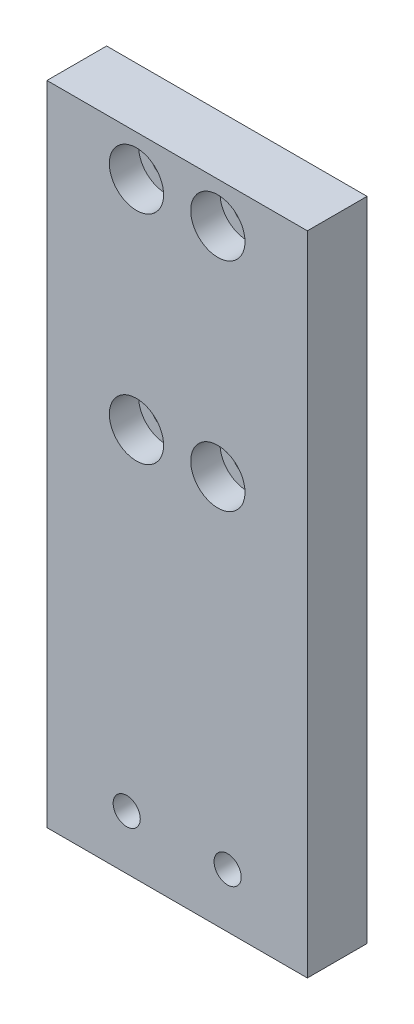
ISO-10303-21;
HEADER;
FILE_DESCRIPTION(('STEP AP214'),'2;1');
FILE_NAME('part.step','',(''),(''),'','','');
FILE_SCHEMA(('AUTOMOTIVE_DESIGN { 1 0 10303 214 1 1 1 1 }'));
ENDSEC;
DATA;
#1=APPLICATION_CONTEXT('core data for automotive mechanical design processes');
#2=APPLICATION_PROTOCOL_DEFINITION('international standard','automotive_design',2000,#1);
#3=PRODUCT_CONTEXT('',#1,'mechanical');
#4=PRODUCT('Part','Part','',(#3));
#5=PRODUCT_RELATED_PRODUCT_CATEGORY('part','',(#4));
#6=PRODUCT_DEFINITION_FORMATION('','',#4);
#7=PRODUCT_DEFINITION_CONTEXT('part definition',#1,'design');
#8=PRODUCT_DEFINITION('design','',#6,#7);
#9=PRODUCT_DEFINITION_SHAPE('','',#8);
#10=(LENGTH_UNIT() NAMED_UNIT(*) SI_UNIT(.MILLI.,.METRE.));
#11=(NAMED_UNIT(*) PLANE_ANGLE_UNIT() SI_UNIT($,.RADIAN.));
#12=(NAMED_UNIT(*) SI_UNIT($,.STERADIAN.) SOLID_ANGLE_UNIT());
#13=UNCERTAINTY_MEASURE_WITH_UNIT(LENGTH_MEASURE(1.E-05),#10,'distance_accuracy_value','');
#14=(GEOMETRIC_REPRESENTATION_CONTEXT(3) GLOBAL_UNCERTAINTY_ASSIGNED_CONTEXT((#13)) GLOBAL_UNIT_ASSIGNED_CONTEXT((#10,
#11,#12)) REPRESENTATION_CONTEXT('',''));
#15=CARTESIAN_POINT('',(0.,0.,0.));
#16=DIRECTION('',(0.,0.,1.));
#17=DIRECTION('',(1.,0.,0.));
#18=AXIS2_PLACEMENT_3D('',#15,#16,#17);
#19=CARTESIAN_POINT('',(-24.,27.5,5.5));
#20=DIRECTION('',(1.,0.,0.));
#21=DIRECTION('',(0.,1.,0.));
#22=AXIS2_PLACEMENT_3D('',#19,#20,#21);
#23=PLANE('',#22);
#24=DIRECTION('',(0.,-1.,0.));
#25=VECTOR('',#24,1.);
#26=CARTESIAN_POINT('',(-24.,27.5,-5.5));
#27=LINE('',#26,#25);
#28=CARTESIAN_POINT('',(-24.,27.5,-5.5));
#29=VERTEX_POINT('',#28);
#30=CARTESIAN_POINT('',(-24.,-91.7772240849822,-5.5));
#31=VERTEX_POINT('',#30);
#32=EDGE_CURVE('E86',#29,#31,#27,.T.);
#33=ORIENTED_EDGE('',*,*,#32,.T.);
#34=DIRECTION('',(0.,0.,-1.));
#35=VECTOR('',#34,1.);
#36=CARTESIAN_POINT('',(-24.,-91.7772240849822,5.5));
#37=LINE('',#36,#35);
#38=CARTESIAN_POINT('',(-24.,-91.7772240849822,5.5));
#39=VERTEX_POINT('',#38);
#40=EDGE_CURVE('E84',#39,#31,#37,.T.);
#41=ORIENTED_EDGE('',*,*,#40,.F.);
#42=DIRECTION('',(0.,-1.,0.));
#43=VECTOR('',#42,1.);
#44=CARTESIAN_POINT('',(-24.,27.5,5.5));
#45=LINE('',#44,#43);
#46=CARTESIAN_POINT('',(-24.,27.5,5.5));
#47=VERTEX_POINT('',#46);
#48=EDGE_CURVE('E74',#47,#39,#45,.T.);
#49=ORIENTED_EDGE('',*,*,#48,.F.);
#50=DIRECTION('',(0.,0.,-1.));
#51=VECTOR('',#50,1.);
#52=CARTESIAN_POINT('',(-24.,27.5,5.5));
#53=LINE('',#52,#51);
#54=EDGE_CURVE('E41',#47,#29,#53,.T.);
#55=ORIENTED_EDGE('',*,*,#54,.T.);
#56=EDGE_LOOP('',(#33,#41,#49,#55));
#57=FACE_BOUND('',#56,.T.);
#58=ADVANCED_FACE('F33',(#57),#23,.F.);
#59=CARTESIAN_POINT('',(24.,27.5,5.5));
#60=DIRECTION('',(-1.,0.,0.));
#61=DIRECTION('',(0.,-1.,0.));
#62=AXIS2_PLACEMENT_3D('',#59,#60,#61);
#63=PLANE('',#62);
#64=DIRECTION('',(0.,1.,0.));
#65=VECTOR('',#64,1.);
#66=CARTESIAN_POINT('',(24.,27.5,-5.5));
#67=LINE('',#66,#65);
#68=CARTESIAN_POINT('',(24.,-91.7772240849822,-5.5));
#69=VERTEX_POINT('',#68);
#70=CARTESIAN_POINT('',(24.,27.5,-5.5));
#71=VERTEX_POINT('',#70);
#72=EDGE_CURVE('E60',#69,#71,#67,.T.);
#73=ORIENTED_EDGE('',*,*,#72,.T.);
#74=DIRECTION('',(0.,0.,-1.));
#75=VECTOR('',#74,1.);
#76=CARTESIAN_POINT('',(24.,27.5,5.5));
#77=LINE('',#76,#75);
#78=CARTESIAN_POINT('',(24.,27.5,5.5));
#79=VERTEX_POINT('',#78);
#80=EDGE_CURVE('E11',#79,#71,#77,.T.);
#81=ORIENTED_EDGE('',*,*,#80,.F.);
#82=DIRECTION('',(0.,1.,0.));
#83=VECTOR('',#82,1.);
#84=CARTESIAN_POINT('',(24.,27.5,5.5));
#85=LINE('',#84,#83);
#86=CARTESIAN_POINT('',(24.,-91.7772240849822,5.5));
#87=VERTEX_POINT('',#86);
#88=EDGE_CURVE('E64',#87,#79,#85,.T.);
#89=ORIENTED_EDGE('',*,*,#88,.F.);
#90=DIRECTION('',(0.,0.,1.));
#91=VECTOR('',#90,1.);
#92=CARTESIAN_POINT('',(24.,-91.7772240849822,-5.5));
#93=LINE('',#92,#91);
#94=EDGE_CURVE('E93',#69,#87,#93,.T.);
#95=ORIENTED_EDGE('',*,*,#94,.F.);
#96=EDGE_LOOP('',(#73,#81,#89,#95));
#97=FACE_BOUND('',#96,.T.);
#98=ADVANCED_FACE('F161',(#97),#63,.F.);
#99=CARTESIAN_POINT('',(-24.,27.5,5.5));
#100=DIRECTION('',(0.,-1.,0.));
#101=DIRECTION('',(1.,0.,0.));
#102=AXIS2_PLACEMENT_3D('',#99,#100,#101);
#103=PLANE('',#102);
#104=DIRECTION('',(-1.,0.,0.));
#105=VECTOR('',#104,1.);
#106=CARTESIAN_POINT('',(-24.,27.5,-5.5));
#107=LINE('',#106,#105);
#108=EDGE_CURVE('E81',#71,#29,#107,.T.);
#109=ORIENTED_EDGE('',*,*,#108,.T.);
#110=ORIENTED_EDGE('',*,*,#54,.F.);
#111=DIRECTION('',(-1.,0.,0.));
#112=VECTOR('',#111,1.);
#113=CARTESIAN_POINT('',(-24.,27.5,5.5));
#114=LINE('',#113,#112);
#115=EDGE_CURVE('E49',#79,#47,#114,.T.);
#116=ORIENTED_EDGE('',*,*,#115,.F.);
#117=ORIENTED_EDGE('',*,*,#80,.T.);
#118=EDGE_LOOP('',(#109,#110,#116,#117));
#119=FACE_BOUND('',#118,.T.);
#120=ADVANCED_FACE('F163',(#119),#103,.F.);
#121=CARTESIAN_POINT('',(0.,0.,5.5));
#122=DIRECTION('',(0.,0.,1.));
#123=DIRECTION('',(1.,0.,0.));
#124=AXIS2_PLACEMENT_3D('',#121,#122,#123);
#125=PLANE('',#124);
#126=CARTESIAN_POINT('',(-9.30000000000001,-81.7772240849822,5.5));
#127=DIRECTION('',(0.,0.,1.));
#128=DIRECTION('',(1.,0.,0.));
#129=AXIS2_PLACEMENT_3D('',#126,#127,#128);
#130=CIRCLE('',#129,2.5);
#131=CARTESIAN_POINT('',(-6.8,-81.7772240849822,5.5));
#132=VERTEX_POINT('',#131);
#133=EDGE_CURVE('E97',#132,#132,#130,.T.);
#134=ORIENTED_EDGE('',*,*,#133,.F.);
#135=EDGE_LOOP('',(#134));
#136=FACE_BOUND('',#135,.T.);
#137=CARTESIAN_POINT('',(9.3,-81.7772240849822,5.5));
#138=DIRECTION('',(0.,0.,1.));
#139=DIRECTION('',(1.,0.,0.));
#140=AXIS2_PLACEMENT_3D('',#137,#138,#139);
#141=CIRCLE('',#140,2.5);
#142=CARTESIAN_POINT('',(11.8,-81.7772240849822,5.5));
#143=VERTEX_POINT('',#142);
#144=EDGE_CURVE('E239',#143,#143,#141,.T.);
#145=ORIENTED_EDGE('',*,*,#144,.F.);
#146=EDGE_LOOP('',(#145));
#147=FACE_BOUND('',#146,.T.);
#148=CARTESIAN_POINT('',(7.5,20.,5.5));
#149=DIRECTION('',(0.,0.,1.));
#150=DIRECTION('',(1.,0.,0.));
#151=AXIS2_PLACEMENT_3D('',#148,#149,#150);
#152=CIRCLE('',#151,5.);
#153=CARTESIAN_POINT('',(12.5,20.,5.5));
#154=VERTEX_POINT('',#153);
#155=EDGE_CURVE('E105',#154,#154,#152,.T.);
#156=ORIENTED_EDGE('',*,*,#155,.F.);
#157=EDGE_LOOP('',(#156));
#158=FACE_BOUND('',#157,.T.);
#159=CARTESIAN_POINT('',(-7.5,20.,5.5));
#160=DIRECTION('',(0.,0.,1.));
#161=DIRECTION('',(1.,0.,0.));
#162=AXIS2_PLACEMENT_3D('',#159,#160,#161);
#163=CIRCLE('',#162,5.);
#164=CARTESIAN_POINT('',(-2.5,20.,5.5));
#165=VERTEX_POINT('',#164);
#166=EDGE_CURVE('E117',#165,#165,#163,.T.);
#167=ORIENTED_EDGE('',*,*,#166,.F.);
#168=EDGE_LOOP('',(#167));
#169=FACE_BOUND('',#168,.T.);
#170=CARTESIAN_POINT('',(7.5,-20.,5.5));
#171=DIRECTION('',(0.,0.,1.));
#172=DIRECTION('',(1.,0.,0.));
#173=AXIS2_PLACEMENT_3D('',#170,#171,#172);
#174=CIRCLE('',#173,5.);
#175=CARTESIAN_POINT('',(12.5,-20.,5.5));
#176=VERTEX_POINT('',#175);
#177=EDGE_CURVE('E129',#176,#176,#174,.T.);
#178=ORIENTED_EDGE('',*,*,#177,.F.);
#179=EDGE_LOOP('',(#178));
#180=FACE_BOUND('',#179,.T.);
#181=CARTESIAN_POINT('',(-7.5,-20.,5.5));
#182=DIRECTION('',(0.,0.,1.));
#183=DIRECTION('',(1.,0.,0.));
#184=AXIS2_PLACEMENT_3D('',#181,#182,#183);
#185=CIRCLE('',#184,5.);
#186=CARTESIAN_POINT('',(-2.5,-20.,5.5));
#187=VERTEX_POINT('',#186);
#188=EDGE_CURVE('E141',#187,#187,#185,.T.);
#189=ORIENTED_EDGE('',*,*,#188,.F.);
#190=EDGE_LOOP('',(#189));
#191=FACE_BOUND('',#190,.T.);
#192=ORIENTED_EDGE('',*,*,#48,.T.);
#193=DIRECTION('',(-1.,0.,0.));
#194=VECTOR('',#193,1.);
#195=CARTESIAN_POINT('',(24.,-91.7772240849822,5.5));
#196=LINE('',#195,#194);
#197=EDGE_CURVE('E78',#87,#39,#196,.T.);
#198=ORIENTED_EDGE('',*,*,#197,.F.);
#199=ORIENTED_EDGE('',*,*,#88,.T.);
#200=ORIENTED_EDGE('',*,*,#115,.T.);
#201=EDGE_LOOP('',(#192,#198,#199,#200));
#202=FACE_BOUND('',#201,.T.);
#203=ADVANCED_FACE('F76',(#136,#147,#158,#169,#180,#191,#202),#125,.T.);
#204=CARTESIAN_POINT('',(0.,0.,-5.5));
#205=DIRECTION('',(0.,0.,1.));
#206=DIRECTION('',(1.,0.,0.));
#207=AXIS2_PLACEMENT_3D('',#204,#205,#206);
#208=PLANE('',#207);
#209=CARTESIAN_POINT('',(-9.30000000000001,-81.7772240849822,-5.5));
#210=DIRECTION('',(0.,0.,1.));
#211=DIRECTION('',(1.,0.,0.));
#212=AXIS2_PLACEMENT_3D('',#209,#210,#211);
#213=CIRCLE('',#212,2.5);
#214=CARTESIAN_POINT('',(-6.8,-81.7772240849822,-5.5));
#215=VERTEX_POINT('',#214);
#216=EDGE_CURVE('E94',#215,#215,#213,.T.);
#217=ORIENTED_EDGE('',*,*,#216,.T.);
#218=EDGE_LOOP('',(#217));
#219=FACE_BOUND('',#218,.T.);
#220=CARTESIAN_POINT('',(9.3,-81.7772240849822,-5.5));
#221=DIRECTION('',(0.,0.,1.));
#222=DIRECTION('',(1.,0.,0.));
#223=AXIS2_PLACEMENT_3D('',#220,#221,#222);
#224=CIRCLE('',#223,2.5);
#225=CARTESIAN_POINT('',(11.8,-81.7772240849822,-5.5));
#226=VERTEX_POINT('',#225);
#227=EDGE_CURVE('E100',#226,#226,#224,.T.);
#228=ORIENTED_EDGE('',*,*,#227,.T.);
#229=EDGE_LOOP('',(#228));
#230=FACE_BOUND('',#229,.T.);
#231=CARTESIAN_POINT('',(7.5,20.,-5.5));
#232=DIRECTION('',(0.,0.,1.));
#233=DIRECTION('',(1.,0.,0.));
#234=AXIS2_PLACEMENT_3D('',#231,#232,#233);
#235=CIRCLE('',#234,2.75);
#236=CARTESIAN_POINT('',(10.25,20.,-5.5));
#237=VERTEX_POINT('',#236);
#238=EDGE_CURVE('E114',#237,#237,#235,.T.);
#239=ORIENTED_EDGE('',*,*,#238,.T.);
#240=EDGE_LOOP('',(#239));
#241=FACE_BOUND('',#240,.T.);
#242=CARTESIAN_POINT('',(-7.5,20.,-5.5));
#243=DIRECTION('',(0.,0.,1.));
#244=DIRECTION('',(1.,0.,0.));
#245=AXIS2_PLACEMENT_3D('',#242,#243,#244);
#246=CIRCLE('',#245,2.75);
#247=CARTESIAN_POINT('',(-4.75,20.,-5.5));
#248=VERTEX_POINT('',#247);
#249=EDGE_CURVE('E126',#248,#248,#246,.T.);
#250=ORIENTED_EDGE('',*,*,#249,.T.);
#251=EDGE_LOOP('',(#250));
#252=FACE_BOUND('',#251,.T.);
#253=CARTESIAN_POINT('',(7.5,-20.,-5.5));
#254=DIRECTION('',(0.,0.,1.));
#255=DIRECTION('',(1.,0.,0.));
#256=AXIS2_PLACEMENT_3D('',#253,#254,#255);
#257=CIRCLE('',#256,2.75);
#258=CARTESIAN_POINT('',(10.25,-20.,-5.5));
#259=VERTEX_POINT('',#258);
#260=EDGE_CURVE('E138',#259,#259,#257,.T.);
#261=ORIENTED_EDGE('',*,*,#260,.T.);
#262=EDGE_LOOP('',(#261));
#263=FACE_BOUND('',#262,.T.);
#264=CARTESIAN_POINT('',(-7.5,-20.,-5.5));
#265=DIRECTION('',(0.,0.,1.));
#266=DIRECTION('',(1.,0.,0.));
#267=AXIS2_PLACEMENT_3D('',#264,#265,#266);
#268=CIRCLE('',#267,2.75);
#269=CARTESIAN_POINT('',(-4.75,-20.,-5.5));
#270=VERTEX_POINT('',#269);
#271=EDGE_CURVE('E150',#270,#270,#268,.T.);
#272=ORIENTED_EDGE('',*,*,#271,.T.);
#273=EDGE_LOOP('',(#272));
#274=FACE_BOUND('',#273,.T.);
#275=ORIENTED_EDGE('',*,*,#32,.F.);
#276=ORIENTED_EDGE('',*,*,#108,.F.);
#277=ORIENTED_EDGE('',*,*,#72,.F.);
#278=DIRECTION('',(1.,0.,0.));
#279=VECTOR('',#278,1.);
#280=CARTESIAN_POINT('',(-24.,-91.7772240849822,-5.5));
#281=LINE('',#280,#279);
#282=EDGE_CURVE('E90',#31,#69,#281,.T.);
#283=ORIENTED_EDGE('',*,*,#282,.F.);
#284=EDGE_LOOP('',(#275,#276,#277,#283));
#285=FACE_BOUND('',#284,.T.);
#286=ADVANCED_FACE('F160',(#219,#230,#241,#252,#263,#274,#285),#208,.F.);
#287=CARTESIAN_POINT('',(-7.5,-20.,5.5));
#288=DIRECTION('',(0.,0.,1.));
#289=DIRECTION('',(1.,0.,0.));
#290=AXIS2_PLACEMENT_3D('',#287,#288,#289);
#291=CYLINDRICAL_SURFACE('',#290,2.75);
#292=ORIENTED_EDGE('',*,*,#271,.F.);
#293=EDGE_LOOP('',(#292));
#294=FACE_BOUND('',#293,.T.);
#295=CARTESIAN_POINT('',(-7.5,-20.,0.0999999999999994));
#296=DIRECTION('',(0.,0.,1.));
#297=DIRECTION('',(1.,0.,0.));
#298=AXIS2_PLACEMENT_3D('',#295,#296,#297);
#299=CIRCLE('',#298,2.75);
#300=CARTESIAN_POINT('',(-4.75,-20.,0.0999999999999994));
#301=VERTEX_POINT('',#300);
#302=EDGE_CURVE('E147',#301,#301,#299,.T.);
#303=ORIENTED_EDGE('',*,*,#302,.T.);
#304=EDGE_LOOP('',(#303));
#305=FACE_BOUND('',#304,.T.);
#306=ADVANCED_FACE('F172',(#294,#305),#291,.F.);
#307=CARTESIAN_POINT('',(-4.75,-20.,0.0999999999999994));
#308=DIRECTION('',(0.,0.,-1.));
#309=DIRECTION('',(-1.,0.,0.));
#310=AXIS2_PLACEMENT_3D('',#307,#308,#309);
#311=PLANE('',#310);
#312=ORIENTED_EDGE('',*,*,#302,.F.);
#313=EDGE_LOOP('',(#312));
#314=FACE_BOUND('',#313,.T.);
#315=CARTESIAN_POINT('',(-7.5,-20.,0.0999999999999994));
#316=DIRECTION('',(0.,0.,1.));
#317=DIRECTION('',(1.,0.,0.));
#318=AXIS2_PLACEMENT_3D('',#315,#316,#317);
#319=CIRCLE('',#318,5.);
#320=CARTESIAN_POINT('',(-2.5,-20.,0.0999999999999994));
#321=VERTEX_POINT('',#320);
#322=EDGE_CURVE('E144',#321,#321,#319,.T.);
#323=ORIENTED_EDGE('',*,*,#322,.T.);
#324=EDGE_LOOP('',(#323));
#325=FACE_BOUND('',#324,.T.);
#326=ADVANCED_FACE('F179',(#314,#325),#311,.F.);
#327=CARTESIAN_POINT('',(-7.5,-20.,5.5));
#328=DIRECTION('',(0.,0.,1.));
#329=DIRECTION('',(1.,0.,0.));
#330=AXIS2_PLACEMENT_3D('',#327,#328,#329);
#331=CYLINDRICAL_SURFACE('',#330,5.);
#332=ORIENTED_EDGE('',*,*,#322,.F.);
#333=EDGE_LOOP('',(#332));
#334=FACE_BOUND('',#333,.T.);
#335=ORIENTED_EDGE('',*,*,#188,.T.);
#336=EDGE_LOOP('',(#335));
#337=FACE_BOUND('',#336,.T.);
#338=ADVANCED_FACE('F183',(#334,#337),#331,.F.);
#339=CARTESIAN_POINT('',(7.5,-20.,5.5));
#340=DIRECTION('',(0.,0.,1.));
#341=DIRECTION('',(1.,0.,0.));
#342=AXIS2_PLACEMENT_3D('',#339,#340,#341);
#343=CYLINDRICAL_SURFACE('',#342,2.75);
#344=ORIENTED_EDGE('',*,*,#260,.F.);
#345=EDGE_LOOP('',(#344));
#346=FACE_BOUND('',#345,.T.);
#347=CARTESIAN_POINT('',(7.5,-20.,0.0999999999999994));
#348=DIRECTION('',(0.,0.,1.));
#349=DIRECTION('',(1.,0.,0.));
#350=AXIS2_PLACEMENT_3D('',#347,#348,#349);
#351=CIRCLE('',#350,2.75);
#352=CARTESIAN_POINT('',(10.25,-20.,0.0999999999999994));
#353=VERTEX_POINT('',#352);
#354=EDGE_CURVE('E135',#353,#353,#351,.T.);
#355=ORIENTED_EDGE('',*,*,#354,.T.);
#356=EDGE_LOOP('',(#355));
#357=FACE_BOUND('',#356,.T.);
#358=ADVANCED_FACE('F187',(#346,#357),#343,.F.);
#359=CARTESIAN_POINT('',(10.25,-20.,0.0999999999999994));
#360=DIRECTION('',(0.,0.,-1.));
#361=DIRECTION('',(-1.,0.,0.));
#362=AXIS2_PLACEMENT_3D('',#359,#360,#361);
#363=PLANE('',#362);
#364=ORIENTED_EDGE('',*,*,#354,.F.);
#365=EDGE_LOOP('',(#364));
#366=FACE_BOUND('',#365,.T.);
#367=CARTESIAN_POINT('',(7.5,-20.,0.0999999999999994));
#368=DIRECTION('',(0.,0.,1.));
#369=DIRECTION('',(1.,0.,0.));
#370=AXIS2_PLACEMENT_3D('',#367,#368,#369);
#371=CIRCLE('',#370,5.);
#372=CARTESIAN_POINT('',(12.5,-20.,0.0999999999999994));
#373=VERTEX_POINT('',#372);
#374=EDGE_CURVE('E132',#373,#373,#371,.T.);
#375=ORIENTED_EDGE('',*,*,#374,.T.);
#376=EDGE_LOOP('',(#375));
#377=FACE_BOUND('',#376,.T.);
#378=ADVANCED_FACE('F191',(#366,#377),#363,.F.);
#379=CARTESIAN_POINT('',(7.5,-20.,5.5));
#380=DIRECTION('',(0.,0.,1.));
#381=DIRECTION('',(1.,0.,0.));
#382=AXIS2_PLACEMENT_3D('',#379,#380,#381);
#383=CYLINDRICAL_SURFACE('',#382,5.);
#384=ORIENTED_EDGE('',*,*,#374,.F.);
#385=EDGE_LOOP('',(#384));
#386=FACE_BOUND('',#385,.T.);
#387=ORIENTED_EDGE('',*,*,#177,.T.);
#388=EDGE_LOOP('',(#387));
#389=FACE_BOUND('',#388,.T.);
#390=ADVANCED_FACE('F195',(#386,#389),#383,.F.);
#391=CARTESIAN_POINT('',(-7.5,20.,5.5));
#392=DIRECTION('',(0.,0.,1.));
#393=DIRECTION('',(1.,0.,0.));
#394=AXIS2_PLACEMENT_3D('',#391,#392,#393);
#395=CYLINDRICAL_SURFACE('',#394,2.75);
#396=ORIENTED_EDGE('',*,*,#249,.F.);
#397=EDGE_LOOP('',(#396));
#398=FACE_BOUND('',#397,.T.);
#399=CARTESIAN_POINT('',(-7.5,20.,0.0999999999999994));
#400=DIRECTION('',(0.,0.,1.));
#401=DIRECTION('',(1.,0.,0.));
#402=AXIS2_PLACEMENT_3D('',#399,#400,#401);
#403=CIRCLE('',#402,2.75);
#404=CARTESIAN_POINT('',(-4.75,20.,0.0999999999999994));
#405=VERTEX_POINT('',#404);
#406=EDGE_CURVE('E123',#405,#405,#403,.T.);
#407=ORIENTED_EDGE('',*,*,#406,.T.);
#408=EDGE_LOOP('',(#407));
#409=FACE_BOUND('',#408,.T.);
#410=ADVANCED_FACE('F199',(#398,#409),#395,.F.);
#411=CARTESIAN_POINT('',(-4.75,20.,0.0999999999999994));
#412=DIRECTION('',(0.,0.,-1.));
#413=DIRECTION('',(-1.,0.,0.));
#414=AXIS2_PLACEMENT_3D('',#411,#412,#413);
#415=PLANE('',#414);
#416=ORIENTED_EDGE('',*,*,#406,.F.);
#417=EDGE_LOOP('',(#416));
#418=FACE_BOUND('',#417,.T.);
#419=CARTESIAN_POINT('',(-7.5,20.,0.0999999999999994));
#420=DIRECTION('',(0.,0.,1.));
#421=DIRECTION('',(1.,0.,0.));
#422=AXIS2_PLACEMENT_3D('',#419,#420,#421);
#423=CIRCLE('',#422,5.);
#424=CARTESIAN_POINT('',(-2.5,20.,0.0999999999999994));
#425=VERTEX_POINT('',#424);
#426=EDGE_CURVE('E120',#425,#425,#423,.T.);
#427=ORIENTED_EDGE('',*,*,#426,.T.);
#428=EDGE_LOOP('',(#427));
#429=FACE_BOUND('',#428,.T.);
#430=ADVANCED_FACE('F203',(#418,#429),#415,.F.);
#431=CARTESIAN_POINT('',(-7.5,20.,5.5));
#432=DIRECTION('',(0.,0.,1.));
#433=DIRECTION('',(1.,0.,0.));
#434=AXIS2_PLACEMENT_3D('',#431,#432,#433);
#435=CYLINDRICAL_SURFACE('',#434,5.);
#436=ORIENTED_EDGE('',*,*,#426,.F.);
#437=EDGE_LOOP('',(#436));
#438=FACE_BOUND('',#437,.T.);
#439=ORIENTED_EDGE('',*,*,#166,.T.);
#440=EDGE_LOOP('',(#439));
#441=FACE_BOUND('',#440,.T.);
#442=ADVANCED_FACE('F207',(#438,#441),#435,.F.);
#443=CARTESIAN_POINT('',(7.5,20.,5.5));
#444=DIRECTION('',(0.,0.,1.));
#445=DIRECTION('',(1.,0.,0.));
#446=AXIS2_PLACEMENT_3D('',#443,#444,#445);
#447=CYLINDRICAL_SURFACE('',#446,2.75);
#448=ORIENTED_EDGE('',*,*,#238,.F.);
#449=EDGE_LOOP('',(#448));
#450=FACE_BOUND('',#449,.T.);
#451=CARTESIAN_POINT('',(7.5,20.,0.0999999999999994));
#452=DIRECTION('',(0.,0.,1.));
#453=DIRECTION('',(1.,0.,0.));
#454=AXIS2_PLACEMENT_3D('',#451,#452,#453);
#455=CIRCLE('',#454,2.75);
#456=CARTESIAN_POINT('',(10.25,20.,0.0999999999999994));
#457=VERTEX_POINT('',#456);
#458=EDGE_CURVE('E111',#457,#457,#455,.T.);
#459=ORIENTED_EDGE('',*,*,#458,.T.);
#460=EDGE_LOOP('',(#459));
#461=FACE_BOUND('',#460,.T.);
#462=ADVANCED_FACE('F211',(#450,#461),#447,.F.);
#463=CARTESIAN_POINT('',(10.25,20.,0.0999999999999994));
#464=DIRECTION('',(0.,0.,-1.));
#465=DIRECTION('',(-1.,0.,0.));
#466=AXIS2_PLACEMENT_3D('',#463,#464,#465);
#467=PLANE('',#466);
#468=ORIENTED_EDGE('',*,*,#458,.F.);
#469=EDGE_LOOP('',(#468));
#470=FACE_BOUND('',#469,.T.);
#471=CARTESIAN_POINT('',(7.5,20.,0.0999999999999994));
#472=DIRECTION('',(0.,0.,1.));
#473=DIRECTION('',(1.,0.,0.));
#474=AXIS2_PLACEMENT_3D('',#471,#472,#473);
#475=CIRCLE('',#474,5.);
#476=CARTESIAN_POINT('',(12.5,20.,0.0999999999999994));
#477=VERTEX_POINT('',#476);
#478=EDGE_CURVE('E108',#477,#477,#475,.T.);
#479=ORIENTED_EDGE('',*,*,#478,.T.);
#480=EDGE_LOOP('',(#479));
#481=FACE_BOUND('',#480,.T.);
#482=ADVANCED_FACE('F215',(#470,#481),#467,.F.);
#483=CARTESIAN_POINT('',(7.5,20.,5.5));
#484=DIRECTION('',(0.,0.,1.));
#485=DIRECTION('',(1.,0.,0.));
#486=AXIS2_PLACEMENT_3D('',#483,#484,#485);
#487=CYLINDRICAL_SURFACE('',#486,5.);
#488=ORIENTED_EDGE('',*,*,#478,.F.);
#489=EDGE_LOOP('',(#488));
#490=FACE_BOUND('',#489,.T.);
#491=ORIENTED_EDGE('',*,*,#155,.T.);
#492=EDGE_LOOP('',(#491));
#493=FACE_BOUND('',#492,.T.);
#494=ADVANCED_FACE('F219',(#490,#493),#487,.F.);
#495=CARTESIAN_POINT('',(0.,-91.7772240849822,0.));
#496=DIRECTION('',(0.,-1.,0.));
#497=DIRECTION('',(1.,0.,0.));
#498=AXIS2_PLACEMENT_3D('',#495,#496,#497);
#499=PLANE('',#498);
#500=ORIENTED_EDGE('',*,*,#197,.T.);
#501=ORIENTED_EDGE('',*,*,#40,.T.);
#502=ORIENTED_EDGE('',*,*,#282,.T.);
#503=ORIENTED_EDGE('',*,*,#94,.T.);
#504=EDGE_LOOP('',(#500,#501,#502,#503));
#505=FACE_BOUND('',#504,.T.);
#506=ADVANCED_FACE('F92',(#505),#499,.T.);
#507=CARTESIAN_POINT('',(9.3,-81.7772240849822,-5.5));
#508=DIRECTION('',(0.,0.,1.));
#509=DIRECTION('',(1.,0.,0.));
#510=AXIS2_PLACEMENT_3D('',#507,#508,#509);
#511=CYLINDRICAL_SURFACE('',#510,2.5);
#512=ORIENTED_EDGE('',*,*,#227,.F.);
#513=EDGE_LOOP('',(#512));
#514=FACE_BOUND('',#513,.T.);
#515=ORIENTED_EDGE('',*,*,#144,.T.);
#516=EDGE_LOOP('',(#515));
#517=FACE_BOUND('',#516,.T.);
#518=ADVANCED_FACE('F226',(#514,#517),#511,.F.);
#519=CARTESIAN_POINT('',(-9.30000000000001,-81.7772240849822,-5.5));
#520=DIRECTION('',(0.,0.,1.));
#521=DIRECTION('',(1.,0.,0.));
#522=AXIS2_PLACEMENT_3D('',#519,#520,#521);
#523=CYLINDRICAL_SURFACE('',#522,2.5);
#524=ORIENTED_EDGE('',*,*,#216,.F.);
#525=EDGE_LOOP('',(#524));
#526=FACE_BOUND('',#525,.T.);
#527=ORIENTED_EDGE('',*,*,#133,.T.);
#528=EDGE_LOOP('',(#527));
#529=FACE_BOUND('',#528,.T.);
#530=ADVANCED_FACE('F229',(#526,#529),#523,.F.);
#531=CLOSED_SHELL('',(#58,#98,#120,#203,#286,#306,#326,#338,#358,#378,#390,#410,#430,#442,#462,
#482,#494,#506,#518,#530));
#532=MANIFOLD_SOLID_BREP('B2',#531);
#533=ADVANCED_BREP_SHAPE_REPRESENTATION('',(#18,#532),#14);
#534=SHAPE_DEFINITION_REPRESENTATION(#9,#533);
ENDSEC;
END-ISO-10303-21;
